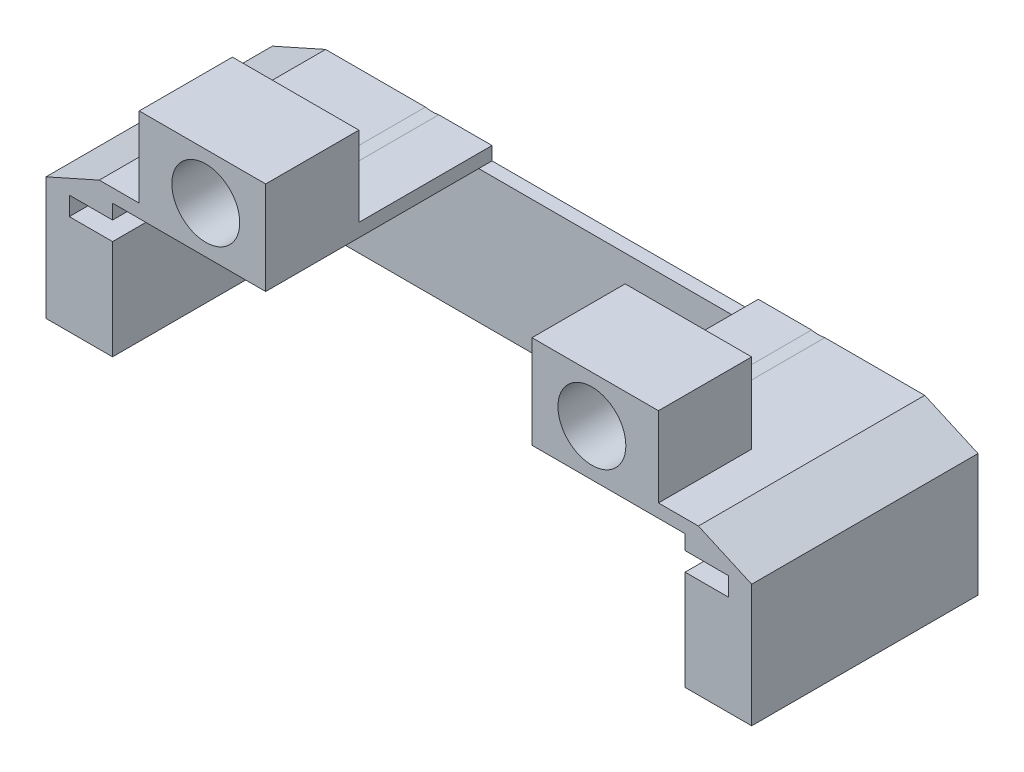
ISO-10303-21;
HEADER;
FILE_DESCRIPTION(('STEP AP214'),'2;1');
FILE_NAME('part.step','',(''),(''),'','','');
FILE_SCHEMA(('AUTOMOTIVE_DESIGN { 1 0 10303 214 1 1 1 1 }'));
ENDSEC;
DATA;
#1=APPLICATION_CONTEXT('core data for automotive mechanical design processes');
#2=APPLICATION_PROTOCOL_DEFINITION('international standard','automotive_design',2000,#1);
#3=PRODUCT_CONTEXT('',#1,'mechanical');
#4=PRODUCT('Part','Part','',(#3));
#5=PRODUCT_RELATED_PRODUCT_CATEGORY('part','',(#4));
#6=PRODUCT_DEFINITION_FORMATION('','',#4);
#7=PRODUCT_DEFINITION_CONTEXT('part definition',#1,'design');
#8=PRODUCT_DEFINITION('design','',#6,#7);
#9=PRODUCT_DEFINITION_SHAPE('','',#8);
#10=(LENGTH_UNIT() NAMED_UNIT(*) SI_UNIT(.MILLI.,.METRE.));
#11=(NAMED_UNIT(*) PLANE_ANGLE_UNIT() SI_UNIT($,.RADIAN.));
#12=(NAMED_UNIT(*) SI_UNIT($,.STERADIAN.) SOLID_ANGLE_UNIT());
#13=UNCERTAINTY_MEASURE_WITH_UNIT(LENGTH_MEASURE(1.E-05),#10,'distance_accuracy_value','');
#14=(GEOMETRIC_REPRESENTATION_CONTEXT(3) GLOBAL_UNCERTAINTY_ASSIGNED_CONTEXT((#13)) GLOBAL_UNIT_ASSIGNED_CONTEXT((#10,
#11,#12)) REPRESENTATION_CONTEXT('',''));
#15=CARTESIAN_POINT('',(0.,0.,0.));
#16=DIRECTION('',(0.,0.,1.));
#17=DIRECTION('',(1.,0.,0.));
#18=AXIS2_PLACEMENT_3D('',#15,#16,#17);
#19=CARTESIAN_POINT('',(-54.9079919345788,27.1123089983022,17.));
#20=DIRECTION('',(0.,-1.,0.));
#21=DIRECTION('',(0.,0.,-1.));
#22=AXIS2_PLACEMENT_3D('',#19,#20,#21);
#23=PLANE('',#22);
#24=DIRECTION('',(0.,0.,1.));
#25=VECTOR('',#24,1.);
#26=CARTESIAN_POINT('',(-39.4079919345789,27.1123089983022,0.));
#27=LINE('',#26,#25);
#28=CARTESIAN_POINT('',(-39.4079919345789,27.1123089983022,10.));
#29=VERTEX_POINT('',#28);
#30=CARTESIAN_POINT('',(-39.4079919345789,27.1123089983022,17.));
#31=VERTEX_POINT('',#30);
#32=EDGE_CURVE('E464',#29,#31,#27,.T.);
#33=ORIENTED_EDGE('',*,*,#32,.F.);
#34=DIRECTION('',(1.,0.,0.));
#35=VECTOR('',#34,1.);
#36=CARTESIAN_POINT('',(-48.9079919345789,27.1123089983022,10.));
#37=LINE('',#36,#35);
#38=CARTESIAN_POINT('',(-48.9079919345789,27.1123089983022,10.));
#39=VERTEX_POINT('',#38);
#40=EDGE_CURVE('E413',#39,#29,#37,.T.);
#41=ORIENTED_EDGE('',*,*,#40,.F.);
#42=DIRECTION('',(0.,0.,1.));
#43=VECTOR('',#42,1.);
#44=CARTESIAN_POINT('',(-48.9079919345789,27.1123089983022,0.));
#45=LINE('',#44,#43);
#46=CARTESIAN_POINT('',(-48.9079919345789,27.1123089983022,17.));
#47=VERTEX_POINT('',#46);
#48=EDGE_CURVE('E280',#39,#47,#45,.T.);
#49=ORIENTED_EDGE('',*,*,#48,.T.);
#50=DIRECTION('',(-1.,0.,0.));
#51=VECTOR('',#50,1.);
#52=CARTESIAN_POINT('',(-54.9079919345788,27.1123089983022,17.));
#53=LINE('',#52,#51);
#54=EDGE_CURVE('E375',#31,#47,#53,.T.);
#55=ORIENTED_EDGE('',*,*,#54,.F.);
#56=EDGE_LOOP('',(#33,#41,#49,#55));
#57=FACE_BOUND('',#56,.T.);
#58=ADVANCED_FACE('F33',(#57),#23,.F.);
#59=CARTESIAN_POINT('',(-50.9079919345788,10.1123089983022,1.));
#60=DIRECTION('',(-1.,0.,0.));
#61=DIRECTION('',(0.,0.,1.));
#62=AXIS2_PLACEMENT_3D('',#59,#60,#61);
#63=PLANE('',#62);
#64=DIRECTION('',(0.,-1.,0.));
#65=VECTOR('',#64,1.);
#66=CARTESIAN_POINT('',(-50.9079919345788,10.1123089983022,1.));
#67=LINE('',#66,#65);
#68=CARTESIAN_POINT('',(-50.9079919345788,17.6123089983022,1.));
#69=VERTEX_POINT('',#68);
#70=CARTESIAN_POINT('',(-50.9079919345788,10.1123089983022,1.));
#71=VERTEX_POINT('',#70);
#72=EDGE_CURVE('E338',#69,#71,#67,.T.);
#73=ORIENTED_EDGE('',*,*,#72,.F.);
#74=DIRECTION('',(0.,0.,1.));
#75=VECTOR('',#74,1.);
#76=CARTESIAN_POINT('',(-50.9079919345788,17.6123089983022,1.));
#77=LINE('',#76,#75);
#78=CARTESIAN_POINT('',(-50.9079919345788,17.6123089983022,17.));
#79=VERTEX_POINT('',#78);
#80=EDGE_CURVE('E320',#69,#79,#77,.T.);
#81=ORIENTED_EDGE('',*,*,#80,.T.);
#82=DIRECTION('',(0.,-1.,0.));
#83=VECTOR('',#82,1.);
#84=CARTESIAN_POINT('',(-50.9079919345788,10.1123089983022,17.));
#85=LINE('',#84,#83);
#86=CARTESIAN_POINT('',(-50.9079919345788,10.1123089983022,17.));
#87=VERTEX_POINT('',#86);
#88=EDGE_CURVE('E331',#79,#87,#85,.T.);
#89=ORIENTED_EDGE('',*,*,#88,.T.);
#90=DIRECTION('',(0.,0.,1.));
#91=VECTOR('',#90,1.);
#92=CARTESIAN_POINT('',(-50.9079919345788,10.1123089983022,1.));
#93=LINE('',#92,#91);
#94=EDGE_CURVE('E346',#71,#87,#93,.T.);
#95=ORIENTED_EDGE('',*,*,#94,.F.);
#96=EDGE_LOOP('',(#73,#81,#89,#95));
#97=FACE_BOUND('',#96,.T.);
#98=ADVANCED_FACE('F615',(#97),#63,.F.);
#99=CARTESIAN_POINT('',(-7.90799193457886,10.1123089983022,1.));
#100=DIRECTION('',(1.,0.,0.));
#101=DIRECTION('',(0.,1.,0.));
#102=AXIS2_PLACEMENT_3D('',#99,#100,#101);
#103=PLANE('',#102);
#104=DIRECTION('',(0.,1.,0.));
#105=VECTOR('',#104,1.);
#106=CARTESIAN_POINT('',(-7.90799193457886,10.1123089983022,17.));
#107=LINE('',#106,#105);
#108=CARTESIAN_POINT('',(-7.90799193457886,10.1123089983022,17.));
#109=VERTEX_POINT('',#108);
#110=CARTESIAN_POINT('',(-7.90799193457886,17.6123089983022,17.));
#111=VERTEX_POINT('',#110);
#112=EDGE_CURVE('E352',#109,#111,#107,.T.);
#113=ORIENTED_EDGE('',*,*,#112,.T.);
#114=DIRECTION('',(0.,0.,-1.));
#115=VECTOR('',#114,1.);
#116=CARTESIAN_POINT('',(-7.90799193457886,17.6123089983022,1.));
#117=LINE('',#116,#115);
#118=CARTESIAN_POINT('',(-7.90799193457886,17.6123089983022,1.));
#119=VERTEX_POINT('',#118);
#120=EDGE_CURVE('E384',#111,#119,#117,.T.);
#121=ORIENTED_EDGE('',*,*,#120,.T.);
#122=DIRECTION('',(0.,1.,0.));
#123=VECTOR('',#122,1.);
#124=CARTESIAN_POINT('',(-7.90799193457886,10.1123089983022,1.));
#125=LINE('',#124,#123);
#126=CARTESIAN_POINT('',(-7.90799193457886,10.1123089983022,1.));
#127=VERTEX_POINT('',#126);
#128=EDGE_CURVE('E339',#127,#119,#125,.T.);
#129=ORIENTED_EDGE('',*,*,#128,.F.);
#130=DIRECTION('',(0.,0.,1.));
#131=VECTOR('',#130,1.);
#132=CARTESIAN_POINT('',(-7.90799193457886,10.1123089983022,1.));
#133=LINE('',#132,#131);
#134=EDGE_CURVE('E366',#127,#109,#133,.T.);
#135=ORIENTED_EDGE('',*,*,#134,.T.);
#136=EDGE_LOOP('',(#113,#121,#129,#135));
#137=FACE_BOUND('',#136,.T.);
#138=ADVANCED_FACE('F578',(#137),#103,.F.);
#139=CARTESIAN_POINT('',(0.,0.,17.));
#140=DIRECTION('',(0.,0.,1.));
#141=DIRECTION('',(1.,0.,0.));
#142=AXIS2_PLACEMENT_3D('',#139,#140,#141);
#143=PLANE('',#142);
#144=DIRECTION('',(0.913085332280026,-0.407768532350246,0.));
#145=VECTOR('',#144,1.);
#146=CARTESIAN_POINT('',(-6.90799193457886,21.1123089983022,17.));
#147=LINE('',#146,#145);
#148=CARTESIAN_POINT('',(-6.90799193457886,21.1123089983022,17.));
#149=VERTEX_POINT('',#148);
#150=CARTESIAN_POINT('',(-2.90799193457886,19.3259763613206,17.));
#151=VERTEX_POINT('',#150);
#152=EDGE_CURVE('E48',#149,#151,#147,.T.);
#153=ORIENTED_EDGE('',*,*,#152,.F.);
#154=DIRECTION('',(1.,0.,0.));
#155=VECTOR('',#154,1.);
#156=CARTESIAN_POINT('',(-3.90799193457886,21.1123089983022,17.));
#157=LINE('',#156,#155);
#158=CARTESIAN_POINT('',(-9.90799193457886,21.1123089983022,17.));
#159=VERTEX_POINT('',#158);
#160=EDGE_CURVE('E262',#159,#149,#157,.T.);
#161=ORIENTED_EDGE('',*,*,#160,.F.);
#162=DIRECTION('',(0.,-1.,0.));
#163=VECTOR('',#162,1.);
#164=CARTESIAN_POINT('',(-9.90799193457886,27.1123089983022,17.));
#165=LINE('',#164,#163);
#166=CARTESIAN_POINT('',(-9.90799193457886,27.1123089983022,17.));
#167=VERTEX_POINT('',#166);
#168=EDGE_CURVE('E273',#167,#159,#165,.T.);
#169=ORIENTED_EDGE('',*,*,#168,.F.);
#170=CARTESIAN_POINT('',(-19.4079919345789,27.1123089983022,17.));
#171=VERTEX_POINT('',#170);
#172=EDGE_CURVE('E377',#167,#171,#53,.T.);
#173=ORIENTED_EDGE('',*,*,#172,.T.);
#174=DIRECTION('',(0.,1.,0.));
#175=VECTOR('',#174,1.);
#176=CARTESIAN_POINT('',(-19.4079919345789,27.1123089983022,17.));
#177=LINE('',#176,#175);
#178=CARTESIAN_POINT('',(-19.4079919345789,20.1123089983022,17.));
#179=VERTEX_POINT('',#178);
#180=EDGE_CURVE('E448',#179,#171,#177,.T.);
#181=ORIENTED_EDGE('',*,*,#180,.F.);
#182=DIRECTION('',(-1.,0.,0.));
#183=VECTOR('',#182,1.);
#184=CARTESIAN_POINT('',(-50.9079919345788,20.1123089983022,17.));
#185=LINE('',#184,#183);
#186=CARTESIAN_POINT('',(-7.90799193457886,20.1123089983022,17.));
#187=VERTEX_POINT('',#186);
#188=EDGE_CURVE('E356',#187,#179,#185,.T.);
#189=ORIENTED_EDGE('',*,*,#188,.F.);
#190=CARTESIAN_POINT('',(-7.90799193457886,19.0123089983022,17.));
#191=VERTEX_POINT('',#190);
#192=EDGE_CURVE('E351',#191,#187,#107,.T.);
#193=ORIENTED_EDGE('',*,*,#192,.F.);
#194=DIRECTION('',(-1.,0.,0.));
#195=VECTOR('',#194,1.);
#196=CARTESIAN_POINT('',(-4.65799193457886,19.0123089983022,17.));
#197=LINE('',#196,#195);
#198=CARTESIAN_POINT('',(-4.65799193457886,19.0123089983022,17.));
#199=VERTEX_POINT('',#198);
#200=EDGE_CURVE('E301',#199,#191,#197,.T.);
#201=ORIENTED_EDGE('',*,*,#200,.F.);
#202=DIRECTION('',(0.,1.,0.));
#203=VECTOR('',#202,1.);
#204=CARTESIAN_POINT('',(-4.65799193457886,17.6123089983022,17.));
#205=LINE('',#204,#203);
#206=CARTESIAN_POINT('',(-4.65799193457886,17.6123089983022,17.));
#207=VERTEX_POINT('',#206);
#208=EDGE_CURVE('E282',#207,#199,#205,.T.);
#209=ORIENTED_EDGE('',*,*,#208,.F.);
#210=DIRECTION('',(1.,0.,0.));
#211=VECTOR('',#210,1.);
#212=CARTESIAN_POINT('',(-4.65799193457886,17.6123089983022,17.));
#213=LINE('',#212,#211);
#214=EDGE_CURVE('E306',#111,#207,#213,.T.);
#215=ORIENTED_EDGE('',*,*,#214,.F.);
#216=ORIENTED_EDGE('',*,*,#112,.F.);
#217=DIRECTION('',(1.,0.,0.));
#218=VECTOR('',#217,1.);
#219=CARTESIAN_POINT('',(-54.9079919345788,10.1123089983022,17.));
#220=LINE('',#219,#218);
#221=CARTESIAN_POINT('',(-2.90799193457886,10.1123089983022,17.));
#222=VERTEX_POINT('',#221);
#223=EDGE_CURVE('E376',#109,#222,#220,.T.);
#224=ORIENTED_EDGE('',*,*,#223,.T.);
#225=DIRECTION('',(0.,-1.,0.));
#226=VECTOR('',#225,1.);
#227=CARTESIAN_POINT('',(-2.90799193457886,21.1123089983022,17.));
#228=LINE('',#227,#226);
#229=EDGE_CURVE('E519',#151,#222,#228,.T.);
#230=ORIENTED_EDGE('',*,*,#229,.F.);
#231=EDGE_LOOP('',(#153,#161,#169,#173,#181,#189,#193,#201,#209,#215,#216,#224,#230));
#232=FACE_BOUND('',#231,.T.);
#233=CARTESIAN_POINT('',(-14.9079919345789,23.6123089983022,17.));
#234=DIRECTION('',(0.,0.,1.));
#235=DIRECTION('',(1.,0.,0.));
#236=AXIS2_PLACEMENT_3D('',#233,#234,#235);
#237=CIRCLE('',#236,2.55);
#238=CARTESIAN_POINT('',(-12.3579919345789,23.6123089983022,17.));
#239=VERTEX_POINT('',#238);
#240=EDGE_CURVE('E323',#239,#239,#237,.T.);
#241=ORIENTED_EDGE('',*,*,#240,.F.);
#242=EDGE_LOOP('',(#241));
#243=FACE_BOUND('',#242,.T.);
#244=ADVANCED_FACE('F515',(#232,#243),#143,.T.);
#245=CARTESIAN_POINT('',(-54.9079919345788,10.1123089983022,17.));
#246=DIRECTION('',(0.,1.,0.));
#247=DIRECTION('',(0.,0.,1.));
#248=AXIS2_PLACEMENT_3D('',#245,#246,#247);
#249=PLANE('',#248);
#250=ORIENTED_EDGE('',*,*,#223,.F.);
#251=ORIENTED_EDGE('',*,*,#134,.F.);
#252=DIRECTION('',(1.,0.,0.));
#253=VECTOR('',#252,1.);
#254=CARTESIAN_POINT('',(-36.9079919345788,10.1123089983022,1.));
#255=LINE('',#254,#253);
#256=EDGE_CURVE('E362',#71,#127,#255,.T.);
#257=ORIENTED_EDGE('',*,*,#256,.F.);
#258=ORIENTED_EDGE('',*,*,#94,.T.);
#259=CARTESIAN_POINT('',(-55.9079919345788,10.1123089983022,17.));
#260=VERTEX_POINT('',#259);
#261=EDGE_CURVE('E372',#260,#87,#220,.T.);
#262=ORIENTED_EDGE('',*,*,#261,.F.);
#263=DIRECTION('',(0.,0.,1.));
#264=VECTOR('',#263,1.);
#265=CARTESIAN_POINT('',(-55.9079919345788,10.1123089983022,17.));
#266=LINE('',#265,#264);
#267=CARTESIAN_POINT('',(-55.9079919345788,10.1123089983022,0.));
#268=VERTEX_POINT('',#267);
#269=EDGE_CURVE('E539',#268,#260,#266,.T.);
#270=ORIENTED_EDGE('',*,*,#269,.F.);
#271=DIRECTION('',(1.,0.,0.));
#272=VECTOR('',#271,1.);
#273=CARTESIAN_POINT('',(-54.9079919345788,10.1123089983022,0.));
#274=LINE('',#273,#272);
#275=CARTESIAN_POINT('',(-2.90799193457886,10.1123089983022,0.));
#276=VERTEX_POINT('',#275);
#277=EDGE_CURVE('E371',#268,#276,#274,.T.);
#278=ORIENTED_EDGE('',*,*,#277,.T.);
#279=DIRECTION('',(0.,0.,-1.));
#280=VECTOR('',#279,1.);
#281=CARTESIAN_POINT('',(-2.90799193457886,10.1123089983022,17.));
#282=LINE('',#281,#280);
#283=EDGE_CURVE('E532',#222,#276,#282,.T.);
#284=ORIENTED_EDGE('',*,*,#283,.F.);
#285=EDGE_LOOP('',(#250,#251,#257,#258,#262,#270,#278,#284));
#286=FACE_BOUND('',#285,.T.);
#287=ADVANCED_FACE('F35',(#286),#249,.F.);
#288=DIRECTION('',(0.,0.,1.));
#289=VECTOR('',#288,1.);
#290=CARTESIAN_POINT('',(-9.90799193457886,27.1123089983022,0.));
#291=LINE('',#290,#289);
#292=CARTESIAN_POINT('',(-9.90799193457886,27.1123089983022,10.));
#293=VERTEX_POINT('',#292);
#294=EDGE_CURVE('E269',#293,#167,#291,.T.);
#295=ORIENTED_EDGE('',*,*,#294,.F.);
#296=CARTESIAN_POINT('',(-19.4079919345789,27.1123089983022,10.));
#297=VERTEX_POINT('',#296);
#298=EDGE_CURVE('E405',#297,#293,#37,.T.);
#299=ORIENTED_EDGE('',*,*,#298,.F.);
#300=DIRECTION('',(0.,0.,1.));
#301=VECTOR('',#300,1.);
#302=CARTESIAN_POINT('',(-19.4079919345789,27.1123089983022,0.));
#303=LINE('',#302,#301);
#304=EDGE_CURVE('E400',#297,#171,#303,.T.);
#305=ORIENTED_EDGE('',*,*,#304,.T.);
#306=ORIENTED_EDGE('',*,*,#172,.F.);
#307=EDGE_LOOP('',(#295,#299,#305,#306));
#308=FACE_BOUND('',#307,.T.);
#309=ADVANCED_FACE('F411',(#308),#23,.F.);
#310=DIRECTION('',(0.913085332280025,0.407768532350249,0.));
#311=VECTOR('',#310,1.);
#312=CARTESIAN_POINT('',(-55.9079919345788,19.3259763613206,17.));
#313=LINE('',#312,#311);
#314=CARTESIAN_POINT('',(-55.9079919345788,19.3259763613206,17.));
#315=VERTEX_POINT('',#314);
#316=CARTESIAN_POINT('',(-51.9079919345788,21.1123089983022,17.));
#317=VERTEX_POINT('',#316);
#318=EDGE_CURVE('E522',#315,#317,#313,.T.);
#319=ORIENTED_EDGE('',*,*,#318,.F.);
#320=DIRECTION('',(0.,1.,0.));
#321=VECTOR('',#320,1.);
#322=CARTESIAN_POINT('',(-55.9079919345788,21.1123089983022,17.));
#323=LINE('',#322,#321);
#324=EDGE_CURVE('E510',#260,#315,#323,.T.);
#325=ORIENTED_EDGE('',*,*,#324,.F.);
#326=ORIENTED_EDGE('',*,*,#261,.T.);
#327=ORIENTED_EDGE('',*,*,#88,.F.);
#328=CARTESIAN_POINT('',(-54.1579919345788,17.6123089983022,17.));
#329=VERTEX_POINT('',#328);
#330=EDGE_CURVE('E288',#329,#79,#213,.T.);
#331=ORIENTED_EDGE('',*,*,#330,.F.);
#332=DIRECTION('',(0.,-1.,0.));
#333=VECTOR('',#332,1.);
#334=CARTESIAN_POINT('',(-54.1579919345788,17.6123089983022,17.));
#335=LINE('',#334,#333);
#336=CARTESIAN_POINT('',(-54.1579919345788,19.0123089983022,17.));
#337=VERTEX_POINT('',#336);
#338=EDGE_CURVE('E303',#337,#329,#335,.T.);
#339=ORIENTED_EDGE('',*,*,#338,.F.);
#340=CARTESIAN_POINT('',(-50.9079919345788,19.0123089983022,17.));
#341=VERTEX_POINT('',#340);
#342=EDGE_CURVE('E300',#341,#337,#197,.T.);
#343=ORIENTED_EDGE('',*,*,#342,.F.);
#344=CARTESIAN_POINT('',(-50.9079919345788,20.1123089983022,17.));
#345=VERTEX_POINT('',#344);
#346=EDGE_CURVE('E348',#345,#341,#85,.T.);
#347=ORIENTED_EDGE('',*,*,#346,.F.);
#348=CARTESIAN_POINT('',(-39.4079919345789,20.1123089983022,17.));
#349=VERTEX_POINT('',#348);
#350=EDGE_CURVE('E355',#349,#345,#185,.T.);
#351=ORIENTED_EDGE('',*,*,#350,.F.);
#352=DIRECTION('',(0.,-1.,0.));
#353=VECTOR('',#352,1.);
#354=CARTESIAN_POINT('',(-39.4079919345789,27.1123089983022,17.));
#355=LINE('',#354,#353);
#356=EDGE_CURVE('E453',#31,#349,#355,.T.);
#357=ORIENTED_EDGE('',*,*,#356,.F.);
#358=ORIENTED_EDGE('',*,*,#54,.T.);
#359=DIRECTION('',(0.,1.,0.));
#360=VECTOR('',#359,1.);
#361=CARTESIAN_POINT('',(-48.9079919345789,27.1123089983022,17.));
#362=LINE('',#361,#360);
#363=CARTESIAN_POINT('',(-48.9079919345789,21.1123089983022,17.));
#364=VERTEX_POINT('',#363);
#365=EDGE_CURVE('E471',#364,#47,#362,.T.);
#366=ORIENTED_EDGE('',*,*,#365,.F.);
#367=DIRECTION('',(1.,0.,0.));
#368=VECTOR('',#367,1.);
#369=CARTESIAN_POINT('',(-54.9079919345788,21.1123089983022,17.));
#370=LINE('',#369,#368);
#371=EDGE_CURVE('E463',#317,#364,#370,.T.);
#372=ORIENTED_EDGE('',*,*,#371,.F.);
#373=EDGE_LOOP('',(#319,#325,#326,#327,#331,#339,#343,#347,#351,#357,#358,#366,#372));
#374=FACE_BOUND('',#373,.T.);
#375=CARTESIAN_POINT('',(-43.9079919345789,23.6123089983022,17.));
#376=DIRECTION('',(0.,0.,1.));
#377=DIRECTION('',(1.,0.,0.));
#378=AXIS2_PLACEMENT_3D('',#375,#376,#377);
#379=CIRCLE('',#378,2.55);
#380=CARTESIAN_POINT('',(-41.3579919345789,23.6123089983022,17.));
#381=VERTEX_POINT('',#380);
#382=EDGE_CURVE('E325',#381,#381,#379,.T.);
#383=ORIENTED_EDGE('',*,*,#382,.F.);
#384=EDGE_LOOP('',(#383));
#385=FACE_BOUND('',#384,.T.);
#386=ADVANCED_FACE('F489',(#374,#385),#143,.T.);
#387=CARTESIAN_POINT('',(0.,0.,0.));
#388=DIRECTION('',(0.,0.,1.));
#389=DIRECTION('',(1.,0.,0.));
#390=AXIS2_PLACEMENT_3D('',#387,#388,#389);
#391=PLANE('',#390);
#392=DIRECTION('',(1.,0.,0.));
#393=VECTOR('',#392,1.);
#394=CARTESIAN_POINT('',(-3.90799193457886,21.1123089983022,0.));
#395=LINE('',#394,#393);
#396=CARTESIAN_POINT('',(-14.4054981535228,21.1123089983022,0.));
#397=VERTEX_POINT('',#396);
#398=CARTESIAN_POINT('',(-6.90799193457886,21.1123089983022,0.));
#399=VERTEX_POINT('',#398);
#400=EDGE_CURVE('E259',#397,#399,#395,.T.);
#401=ORIENTED_EDGE('',*,*,#400,.T.);
#402=DIRECTION('',(0.913085332280026,-0.407768532350246,0.));
#403=VECTOR('',#402,1.);
#404=CARTESIAN_POINT('',(-6.90799193457886,21.1123089983022,0.));
#405=LINE('',#404,#403);
#406=CARTESIAN_POINT('',(-2.90799193457886,19.3259763613206,0.));
#407=VERTEX_POINT('',#406);
#408=EDGE_CURVE('E246',#399,#407,#405,.T.);
#409=ORIENTED_EDGE('',*,*,#408,.T.);
#410=DIRECTION('',(0.,1.,0.));
#411=VECTOR('',#410,1.);
#412=CARTESIAN_POINT('',(-2.90799193457886,10.1123089983022,0.));
#413=LINE('',#412,#411);
#414=EDGE_CURVE('E535',#276,#407,#413,.T.);
#415=ORIENTED_EDGE('',*,*,#414,.F.);
#416=ORIENTED_EDGE('',*,*,#277,.F.);
#417=DIRECTION('',(0.,-1.,0.));
#418=VECTOR('',#417,1.);
#419=CARTESIAN_POINT('',(-55.9079919345788,10.1123089983022,0.));
#420=LINE('',#419,#418);
#421=CARTESIAN_POINT('',(-55.9079919345788,19.3259763613206,0.));
#422=VERTEX_POINT('',#421);
#423=EDGE_CURVE('E537',#422,#268,#420,.T.);
#424=ORIENTED_EDGE('',*,*,#423,.F.);
#425=DIRECTION('',(0.913085332280025,0.407768532350249,0.));
#426=VECTOR('',#425,1.);
#427=CARTESIAN_POINT('',(-55.9079919345788,19.3259763613206,0.));
#428=LINE('',#427,#426);
#429=CARTESIAN_POINT('',(-51.9079919345788,21.1123089983022,0.));
#430=VERTEX_POINT('',#429);
#431=EDGE_CURVE('E56',#422,#430,#428,.T.);
#432=ORIENTED_EDGE('',*,*,#431,.T.);
#433=DIRECTION('',(1.,0.,0.));
#434=VECTOR('',#433,1.);
#435=CARTESIAN_POINT('',(-54.9079919345788,21.1123089983022,0.));
#436=LINE('',#435,#434);
#437=CARTESIAN_POINT('',(-44.4104857156348,21.1123089983022,0.));
#438=VERTEX_POINT('',#437);
#439=EDGE_CURVE('E469',#430,#438,#436,.T.);
#440=ORIENTED_EDGE('',*,*,#439,.T.);
#441=CARTESIAN_POINT('',(-43.9079919345789,23.6123089983022,0.));
#442=DIRECTION('',(0.,0.,1.));
#443=DIRECTION('',(1.,0.,0.));
#444=AXIS2_PLACEMENT_3D('',#441,#442,#443);
#445=CIRCLE('',#444,2.55);
#446=CARTESIAN_POINT('',(-43.4054981535229,21.1123089983022,0.));
#447=VERTEX_POINT('',#446);
#448=EDGE_CURVE('E328',#438,#447,#445,.T.);
#449=ORIENTED_EDGE('',*,*,#448,.T.);
#450=DIRECTION('',(1.,0.,0.));
#451=VECTOR('',#450,1.);
#452=CARTESIAN_POINT('',(-48.9079919345789,21.1123089983022,0.));
#453=LINE('',#452,#451);
#454=CARTESIAN_POINT('',(-39.4079919345789,21.1123089983022,0.));
#455=VERTEX_POINT('',#454);
#456=EDGE_CURVE('E428',#447,#455,#453,.T.);
#457=ORIENTED_EDGE('',*,*,#456,.T.);
#458=DIRECTION('',(0.,-1.,0.));
#459=VECTOR('',#458,1.);
#460=CARTESIAN_POINT('',(-39.4079919345789,27.1123089983022,0.));
#461=LINE('',#460,#459);
#462=CARTESIAN_POINT('',(-39.4079919345789,20.1123089983022,0.));
#463=VERTEX_POINT('',#462);
#464=EDGE_CURVE('E455',#455,#463,#461,.T.);
#465=ORIENTED_EDGE('',*,*,#464,.T.);
#466=DIRECTION('',(1.,0.,0.));
#467=VECTOR('',#466,1.);
#468=CARTESIAN_POINT('',(-39.4079919345789,20.1123089983022,0.));
#469=LINE('',#468,#467);
#470=CARTESIAN_POINT('',(-19.4079919345789,20.1123089983022,0.));
#471=VERTEX_POINT('',#470);
#472=EDGE_CURVE('E449',#463,#471,#469,.T.);
#473=ORIENTED_EDGE('',*,*,#472,.T.);
#474=DIRECTION('',(0.,1.,0.));
#475=VECTOR('',#474,1.);
#476=CARTESIAN_POINT('',(-19.4079919345789,27.1123089983022,0.));
#477=LINE('',#476,#475);
#478=CARTESIAN_POINT('',(-19.4079919345789,21.1123089983022,0.));
#479=VERTEX_POINT('',#478);
#480=EDGE_CURVE('E452',#471,#479,#477,.T.);
#481=ORIENTED_EDGE('',*,*,#480,.T.);
#482=CARTESIAN_POINT('',(-15.4104857156349,21.1123089983022,0.));
#483=VERTEX_POINT('',#482);
#484=EDGE_CURVE('E505',#479,#483,#453,.T.);
#485=ORIENTED_EDGE('',*,*,#484,.T.);
#486=CARTESIAN_POINT('',(-14.9079919345789,23.6123089983022,0.));
#487=DIRECTION('',(0.,0.,1.));
#488=DIRECTION('',(1.,0.,0.));
#489=AXIS2_PLACEMENT_3D('',#486,#487,#488);
#490=CIRCLE('',#489,2.55);
#491=EDGE_CURVE('E268',#483,#397,#490,.T.);
#492=ORIENTED_EDGE('',*,*,#491,.T.);
#493=EDGE_LOOP('',(#401,#409,#415,#416,#424,#432,#440,#449,#457,#465,#473,#481,#485,#492));
#494=FACE_BOUND('',#493,.T.);
#495=ADVANCED_FACE('F265',(#494),#391,.F.);
#496=CARTESIAN_POINT('',(-36.9079919345788,27.1123089983022,1.));
#497=DIRECTION('',(0.,0.,-1.));
#498=DIRECTION('',(-1.,0.,0.));
#499=AXIS2_PLACEMENT_3D('',#496,#497,#498);
#500=PLANE('',#499);
#501=DIRECTION('',(-1.,0.,0.));
#502=VECTOR('',#501,1.);
#503=CARTESIAN_POINT('',(-50.9079919345788,20.1123089983022,1.));
#504=LINE('',#503,#502);
#505=CARTESIAN_POINT('',(-7.90799193457886,20.1123089983022,1.));
#506=VERTEX_POINT('',#505);
#507=CARTESIAN_POINT('',(-19.4079919345789,20.1123089983022,1.));
#508=VERTEX_POINT('',#507);
#509=EDGE_CURVE('E343',#506,#508,#504,.T.);
#510=ORIENTED_EDGE('',*,*,#509,.T.);
#511=CARTESIAN_POINT('',(-39.4079919345789,20.1123089983022,1.));
#512=VERTEX_POINT('',#511);
#513=EDGE_CURVE('E347',#508,#512,#504,.T.);
#514=ORIENTED_EDGE('',*,*,#513,.T.);
#515=CARTESIAN_POINT('',(-50.9079919345788,20.1123089983022,1.));
#516=VERTEX_POINT('',#515);
#517=EDGE_CURVE('E342',#512,#516,#504,.T.);
#518=ORIENTED_EDGE('',*,*,#517,.T.);
#519=CARTESIAN_POINT('',(-50.9079919345788,19.0123089983022,1.));
#520=VERTEX_POINT('',#519);
#521=EDGE_CURVE('E334',#516,#520,#67,.T.);
#522=ORIENTED_EDGE('',*,*,#521,.T.);
#523=DIRECTION('',(-1.,0.,0.));
#524=VECTOR('',#523,1.);
#525=CARTESIAN_POINT('',(-4.65799193457886,19.0123089983022,1.));
#526=LINE('',#525,#524);
#527=CARTESIAN_POINT('',(-54.1579919345788,19.0123089983022,1.));
#528=VERTEX_POINT('',#527);
#529=EDGE_CURVE('E287',#520,#528,#526,.T.);
#530=ORIENTED_EDGE('',*,*,#529,.T.);
#531=DIRECTION('',(0.,-1.,0.));
#532=VECTOR('',#531,1.);
#533=CARTESIAN_POINT('',(-54.1579919345788,17.6123089983022,1.));
#534=LINE('',#533,#532);
#535=CARTESIAN_POINT('',(-54.1579919345788,17.6123089983022,1.));
#536=VERTEX_POINT('',#535);
#537=EDGE_CURVE('E291',#528,#536,#534,.T.);
#538=ORIENTED_EDGE('',*,*,#537,.T.);
#539=DIRECTION('',(1.,0.,0.));
#540=VECTOR('',#539,1.);
#541=CARTESIAN_POINT('',(-4.65799193457886,17.6123089983022,1.));
#542=LINE('',#541,#540);
#543=EDGE_CURVE('E295',#536,#69,#542,.T.);
#544=ORIENTED_EDGE('',*,*,#543,.T.);
#545=ORIENTED_EDGE('',*,*,#72,.T.);
#546=ORIENTED_EDGE('',*,*,#256,.T.);
#547=ORIENTED_EDGE('',*,*,#128,.T.);
#548=CARTESIAN_POINT('',(-4.65799193457886,17.6123089983022,1.));
#549=VERTEX_POINT('',#548);
#550=EDGE_CURVE('E294',#119,#549,#542,.T.);
#551=ORIENTED_EDGE('',*,*,#550,.T.);
#552=DIRECTION('',(0.,1.,0.));
#553=VECTOR('',#552,1.);
#554=CARTESIAN_POINT('',(-4.65799193457886,17.6123089983022,1.));
#555=LINE('',#554,#553);
#556=CARTESIAN_POINT('',(-4.65799193457886,19.0123089983022,1.));
#557=VERTEX_POINT('',#556);
#558=EDGE_CURVE('E284',#549,#557,#555,.T.);
#559=ORIENTED_EDGE('',*,*,#558,.T.);
#560=CARTESIAN_POINT('',(-7.90799193457886,19.0123089983022,1.));
#561=VERTEX_POINT('',#560);
#562=EDGE_CURVE('E289',#557,#561,#526,.T.);
#563=ORIENTED_EDGE('',*,*,#562,.T.);
#564=EDGE_CURVE('E337',#561,#506,#125,.T.);
#565=ORIENTED_EDGE('',*,*,#564,.T.);
#566=EDGE_LOOP('',(#510,#514,#518,#522,#530,#538,#544,#545,#546,#547,#551,#559,#563,#565));
#567=FACE_BOUND('',#566,.T.);
#568=ADVANCED_FACE('F556',(#567),#500,.F.);
#569=CARTESIAN_POINT('',(-50.9079919345788,20.1123089983022,1.));
#570=DIRECTION('',(0.,1.,0.));
#571=DIRECTION('',(0.,0.,1.));
#572=AXIS2_PLACEMENT_3D('',#569,#570,#571);
#573=PLANE('',#572);
#574=ORIENTED_EDGE('',*,*,#517,.F.);
#575=DIRECTION('',(0.,0.,1.));
#576=VECTOR('',#575,1.);
#577=CARTESIAN_POINT('',(-39.4079919345789,20.1123089983022,1.));
#578=LINE('',#577,#576);
#579=EDGE_CURVE('E390',#512,#349,#578,.T.);
#580=ORIENTED_EDGE('',*,*,#579,.T.);
#581=ORIENTED_EDGE('',*,*,#350,.T.);
#582=DIRECTION('',(0.,0.,1.));
#583=VECTOR('',#582,1.);
#584=CARTESIAN_POINT('',(-50.9079919345788,20.1123089983022,1.));
#585=LINE('',#584,#583);
#586=EDGE_CURVE('E359',#516,#345,#585,.T.);
#587=ORIENTED_EDGE('',*,*,#586,.F.);
#588=EDGE_LOOP('',(#574,#580,#581,#587));
#589=FACE_BOUND('',#588,.T.);
#590=ADVANCED_FACE('F628',(#589),#573,.F.);
#591=ORIENTED_EDGE('',*,*,#346,.T.);
#592=DIRECTION('',(0.,0.,-1.));
#593=VECTOR('',#592,1.);
#594=CARTESIAN_POINT('',(-50.9079919345788,19.0123089983022,1.));
#595=LINE('',#594,#593);
#596=EDGE_CURVE('E311',#341,#520,#595,.T.);
#597=ORIENTED_EDGE('',*,*,#596,.T.);
#598=ORIENTED_EDGE('',*,*,#521,.F.);
#599=ORIENTED_EDGE('',*,*,#586,.T.);
#600=EDGE_LOOP('',(#591,#597,#598,#599));
#601=FACE_BOUND('',#600,.T.);
#602=ADVANCED_FACE('F621',(#601),#63,.F.);
#603=ORIENTED_EDGE('',*,*,#188,.T.);
#604=DIRECTION('',(0.,0.,-1.));
#605=VECTOR('',#604,1.);
#606=CARTESIAN_POINT('',(-19.4079919345789,20.1123089983022,1.));
#607=LINE('',#606,#605);
#608=EDGE_CURVE('E387',#179,#508,#607,.T.);
#609=ORIENTED_EDGE('',*,*,#608,.T.);
#610=ORIENTED_EDGE('',*,*,#509,.F.);
#611=DIRECTION('',(0.,0.,1.));
#612=VECTOR('',#611,1.);
#613=CARTESIAN_POINT('',(-7.90799193457886,20.1123089983022,1.));
#614=LINE('',#613,#612);
#615=EDGE_CURVE('E363',#506,#187,#614,.T.);
#616=ORIENTED_EDGE('',*,*,#615,.T.);
#617=EDGE_LOOP('',(#603,#609,#610,#616));
#618=FACE_BOUND('',#617,.T.);
#619=ADVANCED_FACE('F552',(#618),#573,.F.);
#620=ORIENTED_EDGE('',*,*,#564,.F.);
#621=DIRECTION('',(0.,0.,1.));
#622=VECTOR('',#621,1.);
#623=CARTESIAN_POINT('',(-7.90799193457886,19.0123089983022,1.));
#624=LINE('',#623,#622);
#625=EDGE_CURVE('E380',#561,#191,#624,.T.);
#626=ORIENTED_EDGE('',*,*,#625,.T.);
#627=ORIENTED_EDGE('',*,*,#192,.T.);
#628=ORIENTED_EDGE('',*,*,#615,.F.);
#629=EDGE_LOOP('',(#620,#626,#627,#628));
#630=FACE_BOUND('',#629,.T.);
#631=ADVANCED_FACE('F562',(#630),#103,.F.);
#632=CARTESIAN_POINT('',(-43.9079919345789,23.6123089983022,0.));
#633=DIRECTION('',(0.,0.,1.));
#634=DIRECTION('',(1.,0.,0.));
#635=AXIS2_PLACEMENT_3D('',#632,#633,#634);
#636=CYLINDRICAL_SURFACE('',#635,2.55);
#637=CARTESIAN_POINT('',(-43.9079919345789,23.6123089983022,10.));
#638=DIRECTION('',(0.,0.,1.));
#639=DIRECTION('',(1.,0.,0.));
#640=AXIS2_PLACEMENT_3D('',#637,#638,#639);
#641=CIRCLE('',#640,2.55);
#642=CARTESIAN_POINT('',(-44.4104857156349,21.1123089983022,10.));
#643=VERTEX_POINT('',#642);
#644=CARTESIAN_POINT('',(-43.4054981535228,21.1123089983022,10.));
#645=VERTEX_POINT('',#644);
#646=EDGE_CURVE('E431',#643,#645,#641,.F.);
#647=ORIENTED_EDGE('',*,*,#646,.T.);
#648=DIRECTION('',(0.,0.,1.));
#649=VECTOR('',#648,1.);
#650=CARTESIAN_POINT('',(-43.4054981535229,21.1123089983022,0.));
#651=LINE('',#650,#649);
#652=EDGE_CURVE('E445',#645,#447,#651,.F.);
#653=ORIENTED_EDGE('',*,*,#652,.T.);
#654=ORIENTED_EDGE('',*,*,#448,.F.);
#655=DIRECTION('',(0.,0.,1.));
#656=VECTOR('',#655,1.);
#657=CARTESIAN_POINT('',(-44.4104857156348,21.1123089983022,0.));
#658=LINE('',#657,#656);
#659=EDGE_CURVE('E442',#438,#643,#658,.T.);
#660=ORIENTED_EDGE('',*,*,#659,.T.);
#661=EDGE_LOOP('',(#647,#653,#654,#660));
#662=FACE_BOUND('',#661,.T.);
#663=ORIENTED_EDGE('',*,*,#382,.T.);
#664=EDGE_LOOP('',(#663));
#665=FACE_BOUND('',#664,.T.);
#666=ADVANCED_FACE('F599',(#662,#665),#636,.F.);
#667=CARTESIAN_POINT('',(-14.9079919345789,23.6123089983022,0.));
#668=DIRECTION('',(0.,0.,1.));
#669=DIRECTION('',(1.,0.,0.));
#670=AXIS2_PLACEMENT_3D('',#667,#668,#669);
#671=CYLINDRICAL_SURFACE('',#670,2.55);
#672=CARTESIAN_POINT('',(-14.9079919345789,23.6123089983022,10.));
#673=DIRECTION('',(0.,0.,1.));
#674=DIRECTION('',(1.,0.,0.));
#675=AXIS2_PLACEMENT_3D('',#672,#673,#674);
#676=CIRCLE('',#675,2.55);
#677=CARTESIAN_POINT('',(-15.4104857156349,21.1123089983022,10.));
#678=VERTEX_POINT('',#677);
#679=CARTESIAN_POINT('',(-14.4054981535228,21.1123089983022,10.));
#680=VERTEX_POINT('',#679);
#681=EDGE_CURVE('E427',#678,#680,#676,.F.);
#682=ORIENTED_EDGE('',*,*,#681,.T.);
#683=DIRECTION('',(0.,0.,1.));
#684=VECTOR('',#683,1.);
#685=CARTESIAN_POINT('',(-14.4054981535228,21.1123089983022,0.));
#686=LINE('',#685,#684);
#687=EDGE_CURVE('E440',#680,#397,#686,.F.);
#688=ORIENTED_EDGE('',*,*,#687,.T.);
#689=ORIENTED_EDGE('',*,*,#491,.F.);
#690=DIRECTION('',(0.,0.,1.));
#691=VECTOR('',#690,1.);
#692=CARTESIAN_POINT('',(-15.4104857156349,21.1123089983022,0.));
#693=LINE('',#692,#691);
#694=EDGE_CURVE('E437',#483,#678,#693,.T.);
#695=ORIENTED_EDGE('',*,*,#694,.T.);
#696=EDGE_LOOP('',(#682,#688,#689,#695));
#697=FACE_BOUND('',#696,.T.);
#698=ORIENTED_EDGE('',*,*,#240,.T.);
#699=EDGE_LOOP('',(#698));
#700=FACE_BOUND('',#699,.T.);
#701=ADVANCED_FACE('F602',(#697,#700),#671,.F.);
#702=CARTESIAN_POINT('',(-4.65799193457886,19.0123089983022,1.));
#703=DIRECTION('',(0.,1.,0.));
#704=DIRECTION('',(-1.,0.,0.));
#705=AXIS2_PLACEMENT_3D('',#702,#703,#704);
#706=PLANE('',#705);
#707=ORIENTED_EDGE('',*,*,#562,.F.);
#708=DIRECTION('',(0.,0.,1.));
#709=VECTOR('',#708,1.);
#710=CARTESIAN_POINT('',(-4.65799193457886,19.0123089983022,1.));
#711=LINE('',#710,#709);
#712=EDGE_CURVE('E297',#557,#199,#711,.T.);
#713=ORIENTED_EDGE('',*,*,#712,.T.);
#714=ORIENTED_EDGE('',*,*,#200,.T.);
#715=ORIENTED_EDGE('',*,*,#625,.F.);
#716=EDGE_LOOP('',(#707,#713,#714,#715));
#717=FACE_BOUND('',#716,.T.);
#718=ADVANCED_FACE('F568',(#717),#706,.F.);
#719=CARTESIAN_POINT('',(-4.65799193457886,17.6123089983022,1.));
#720=DIRECTION('',(0.,-1.,0.));
#721=DIRECTION('',(1.,0.,0.));
#722=AXIS2_PLACEMENT_3D('',#719,#720,#721);
#723=PLANE('',#722);
#724=ORIENTED_EDGE('',*,*,#214,.T.);
#725=DIRECTION('',(0.,0.,1.));
#726=VECTOR('',#725,1.);
#727=CARTESIAN_POINT('',(-4.65799193457886,17.6123089983022,1.));
#728=LINE('',#727,#726);
#729=EDGE_CURVE('E308',#549,#207,#728,.T.);
#730=ORIENTED_EDGE('',*,*,#729,.F.);
#731=ORIENTED_EDGE('',*,*,#550,.F.);
#732=ORIENTED_EDGE('',*,*,#120,.F.);
#733=EDGE_LOOP('',(#724,#730,#731,#732));
#734=FACE_BOUND('',#733,.T.);
#735=ADVANCED_FACE('F574',(#734),#723,.F.);
#736=CARTESIAN_POINT('',(-4.65799193457886,17.6123089983022,1.));
#737=DIRECTION('',(1.,0.,0.));
#738=DIRECTION('',(0.,1.,0.));
#739=AXIS2_PLACEMENT_3D('',#736,#737,#738);
#740=PLANE('',#739);
#741=ORIENTED_EDGE('',*,*,#208,.T.);
#742=ORIENTED_EDGE('',*,*,#712,.F.);
#743=ORIENTED_EDGE('',*,*,#558,.F.);
#744=ORIENTED_EDGE('',*,*,#729,.T.);
#745=EDGE_LOOP('',(#741,#742,#743,#744));
#746=FACE_BOUND('',#745,.T.);
#747=ADVANCED_FACE('F571',(#746),#740,.F.);
#748=ORIENTED_EDGE('',*,*,#543,.F.);
#749=DIRECTION('',(0.,0.,1.));
#750=VECTOR('',#749,1.);
#751=CARTESIAN_POINT('',(-54.1579919345788,17.6123089983022,1.));
#752=LINE('',#751,#750);
#753=EDGE_CURVE('E312',#536,#329,#752,.T.);
#754=ORIENTED_EDGE('',*,*,#753,.T.);
#755=ORIENTED_EDGE('',*,*,#330,.T.);
#756=ORIENTED_EDGE('',*,*,#80,.F.);
#757=EDGE_LOOP('',(#748,#754,#755,#756));
#758=FACE_BOUND('',#757,.T.);
#759=ADVANCED_FACE('F651',(#758),#723,.F.);
#760=ORIENTED_EDGE('',*,*,#342,.T.);
#761=DIRECTION('',(0.,0.,1.));
#762=VECTOR('',#761,1.);
#763=CARTESIAN_POINT('',(-54.1579919345788,19.0123089983022,1.));
#764=LINE('',#763,#762);
#765=EDGE_CURVE('E314',#528,#337,#764,.T.);
#766=ORIENTED_EDGE('',*,*,#765,.F.);
#767=ORIENTED_EDGE('',*,*,#529,.F.);
#768=ORIENTED_EDGE('',*,*,#596,.F.);
#769=EDGE_LOOP('',(#760,#766,#767,#768));
#770=FACE_BOUND('',#769,.T.);
#771=ADVANCED_FACE('F644',(#770),#706,.F.);
#772=CARTESIAN_POINT('',(-54.1579919345788,17.6123089983022,1.));
#773=DIRECTION('',(-1.,0.,0.));
#774=DIRECTION('',(0.,0.,1.));
#775=AXIS2_PLACEMENT_3D('',#772,#773,#774);
#776=PLANE('',#775);
#777=ORIENTED_EDGE('',*,*,#338,.T.);
#778=ORIENTED_EDGE('',*,*,#753,.F.);
#779=ORIENTED_EDGE('',*,*,#537,.F.);
#780=ORIENTED_EDGE('',*,*,#765,.T.);
#781=EDGE_LOOP('',(#777,#778,#779,#780));
#782=FACE_BOUND('',#781,.T.);
#783=ADVANCED_FACE('F647',(#782),#776,.F.);
#784=CARTESIAN_POINT('',(-3.90799193457886,21.1123089983022,0.));
#785=DIRECTION('',(0.,-1.,0.));
#786=DIRECTION('',(0.,0.,-1.));
#787=AXIS2_PLACEMENT_3D('',#784,#785,#786);
#788=PLANE('',#787);
#789=ORIENTED_EDGE('',*,*,#160,.T.);
#790=DIRECTION('',(0.,0.,1.));
#791=VECTOR('',#790,1.);
#792=CARTESIAN_POINT('',(-6.90799193457886,21.1123089983022,0.));
#793=LINE('',#792,#791);
#794=EDGE_CURVE('E249',#399,#149,#793,.T.);
#795=ORIENTED_EDGE('',*,*,#794,.F.);
#796=ORIENTED_EDGE('',*,*,#400,.F.);
#797=ORIENTED_EDGE('',*,*,#687,.F.);
#798=DIRECTION('',(1.,0.,0.));
#799=VECTOR('',#798,1.);
#800=CARTESIAN_POINT('',(-48.9079919345789,21.1123089983022,10.));
#801=LINE('',#800,#799);
#802=CARTESIAN_POINT('',(-9.90799193457886,21.1123089983022,10.));
#803=VERTEX_POINT('',#802);
#804=EDGE_CURVE('E416',#680,#803,#801,.T.);
#805=ORIENTED_EDGE('',*,*,#804,.T.);
#806=DIRECTION('',(0.,0.,1.));
#807=VECTOR('',#806,1.);
#808=CARTESIAN_POINT('',(-9.90799193457886,21.1123089983022,0.));
#809=LINE('',#808,#807);
#810=EDGE_CURVE('E271',#803,#159,#809,.T.);
#811=ORIENTED_EDGE('',*,*,#810,.T.);
#812=EDGE_LOOP('',(#789,#795,#796,#797,#805,#811));
#813=FACE_BOUND('',#812,.T.);
#814=ADVANCED_FACE('F258',(#813),#788,.F.);
#815=CARTESIAN_POINT('',(-9.90799193457886,27.1123089983022,0.));
#816=DIRECTION('',(-1.,0.,0.));
#817=DIRECTION('',(0.,-1.,0.));
#818=AXIS2_PLACEMENT_3D('',#815,#816,#817);
#819=PLANE('',#818);
#820=ORIENTED_EDGE('',*,*,#810,.F.);
#821=DIRECTION('',(0.,-1.,0.));
#822=VECTOR('',#821,1.);
#823=CARTESIAN_POINT('',(-9.90799193457886,21.1123089983022,10.));
#824=LINE('',#823,#822);
#825=EDGE_CURVE('E418',#293,#803,#824,.T.);
#826=ORIENTED_EDGE('',*,*,#825,.F.);
#827=ORIENTED_EDGE('',*,*,#294,.T.);
#828=ORIENTED_EDGE('',*,*,#168,.T.);
#829=EDGE_LOOP('',(#820,#826,#827,#828));
#830=FACE_BOUND('',#829,.T.);
#831=ADVANCED_FACE('F512',(#830),#819,.F.);
#832=CARTESIAN_POINT('',(-48.9079919345789,27.1123089983022,0.));
#833=DIRECTION('',(1.,0.,0.));
#834=DIRECTION('',(0.,0.,-1.));
#835=AXIS2_PLACEMENT_3D('',#832,#833,#834);
#836=PLANE('',#835);
#837=ORIENTED_EDGE('',*,*,#48,.F.);
#838=DIRECTION('',(0.,-1.,0.));
#839=VECTOR('',#838,1.);
#840=CARTESIAN_POINT('',(-48.9079919345789,21.1123089983022,10.));
#841=LINE('',#840,#839);
#842=CARTESIAN_POINT('',(-48.9079919345789,21.1123089983022,10.));
#843=VERTEX_POINT('',#842);
#844=EDGE_CURVE('E414',#39,#843,#841,.T.);
#845=ORIENTED_EDGE('',*,*,#844,.T.);
#846=DIRECTION('',(0.,0.,1.));
#847=VECTOR('',#846,1.);
#848=CARTESIAN_POINT('',(-48.9079919345789,21.1123089983022,0.));
#849=LINE('',#848,#847);
#850=EDGE_CURVE('E277',#843,#364,#849,.T.);
#851=ORIENTED_EDGE('',*,*,#850,.T.);
#852=ORIENTED_EDGE('',*,*,#365,.T.);
#853=EDGE_LOOP('',(#837,#845,#851,#852));
#854=FACE_BOUND('',#853,.T.);
#855=ADVANCED_FACE('F483',(#854),#836,.F.);
#856=CARTESIAN_POINT('',(-54.9079919345788,21.1123089983022,0.));
#857=DIRECTION('',(0.,-1.,0.));
#858=DIRECTION('',(0.,0.,-1.));
#859=AXIS2_PLACEMENT_3D('',#856,#857,#858);
#860=PLANE('',#859);
#861=ORIENTED_EDGE('',*,*,#439,.F.);
#862=DIRECTION('',(0.,0.,1.));
#863=VECTOR('',#862,1.);
#864=CARTESIAN_POINT('',(-51.9079919345788,21.1123089983022,0.));
#865=LINE('',#864,#863);
#866=EDGE_CURVE('E527',#430,#317,#865,.T.);
#867=ORIENTED_EDGE('',*,*,#866,.T.);
#868=ORIENTED_EDGE('',*,*,#371,.T.);
#869=ORIENTED_EDGE('',*,*,#850,.F.);
#870=EDGE_CURVE('E422',#843,#643,#801,.T.);
#871=ORIENTED_EDGE('',*,*,#870,.T.);
#872=ORIENTED_EDGE('',*,*,#659,.F.);
#873=EDGE_LOOP('',(#861,#867,#868,#869,#871,#872));
#874=FACE_BOUND('',#873,.T.);
#875=ADVANCED_FACE('F596',(#874),#860,.F.);
#876=CARTESIAN_POINT('',(-39.4079919345789,20.1123089983022,0.));
#877=DIRECTION('',(0.,-1.,0.));
#878=DIRECTION('',(0.,0.,-1.));
#879=AXIS2_PLACEMENT_3D('',#876,#877,#878);
#880=PLANE('',#879);
#881=DIRECTION('',(0.,0.,1.));
#882=VECTOR('',#881,1.);
#883=CARTESIAN_POINT('',(-19.4079919345789,20.1123089983022,0.));
#884=LINE('',#883,#882);
#885=EDGE_CURVE('E457',#471,#508,#884,.T.);
#886=ORIENTED_EDGE('',*,*,#885,.F.);
#887=ORIENTED_EDGE('',*,*,#472,.F.);
#888=DIRECTION('',(0.,0.,1.));
#889=VECTOR('',#888,1.);
#890=CARTESIAN_POINT('',(-39.4079919345789,20.1123089983022,0.));
#891=LINE('',#890,#889);
#892=EDGE_CURVE('E460',#463,#512,#891,.T.);
#893=ORIENTED_EDGE('',*,*,#892,.T.);
#894=ORIENTED_EDGE('',*,*,#513,.F.);
#895=EDGE_LOOP('',(#886,#887,#893,#894));
#896=FACE_BOUND('',#895,.T.);
#897=ADVANCED_FACE('F548',(#896),#880,.F.);
#898=CARTESIAN_POINT('',(-39.4079919345789,27.1123089983022,0.));
#899=DIRECTION('',(-1.,0.,0.));
#900=DIRECTION('',(0.,0.,1.));
#901=AXIS2_PLACEMENT_3D('',#898,#899,#900);
#902=PLANE('',#901);
#903=ORIENTED_EDGE('',*,*,#464,.F.);
#904=DIRECTION('',(0.,0.,1.));
#905=VECTOR('',#904,1.);
#906=CARTESIAN_POINT('',(-39.4079919345789,21.1123089983022,0.));
#907=LINE('',#906,#905);
#908=CARTESIAN_POINT('',(-39.4079919345789,21.1123089983022,10.));
#909=VERTEX_POINT('',#908);
#910=EDGE_CURVE('E434',#455,#909,#907,.T.);
#911=ORIENTED_EDGE('',*,*,#910,.T.);
#912=DIRECTION('',(0.,1.,0.));
#913=VECTOR('',#912,1.);
#914=CARTESIAN_POINT('',(-39.4079919345789,27.1123089983022,10.));
#915=LINE('',#914,#913);
#916=EDGE_CURVE('E424',#909,#29,#915,.T.);
#917=ORIENTED_EDGE('',*,*,#916,.T.);
#918=ORIENTED_EDGE('',*,*,#32,.T.);
#919=ORIENTED_EDGE('',*,*,#356,.T.);
#920=ORIENTED_EDGE('',*,*,#579,.F.);
#921=ORIENTED_EDGE('',*,*,#892,.F.);
#922=EDGE_LOOP('',(#903,#911,#917,#918,#919,#920,#921));
#923=FACE_BOUND('',#922,.T.);
#924=ADVANCED_FACE('F496',(#923),#902,.F.);
#925=CARTESIAN_POINT('',(-19.4079919345789,27.1123089983022,0.));
#926=DIRECTION('',(1.,0.,0.));
#927=DIRECTION('',(0.,0.,-1.));
#928=AXIS2_PLACEMENT_3D('',#925,#926,#927);
#929=PLANE('',#928);
#930=DIRECTION('',(0.,-1.,0.));
#931=VECTOR('',#930,1.);
#932=CARTESIAN_POINT('',(-19.4079919345789,27.1123089983022,10.));
#933=LINE('',#932,#931);
#934=CARTESIAN_POINT('',(-19.4079919345789,21.1123089983022,10.));
#935=VERTEX_POINT('',#934);
#936=EDGE_CURVE('E41',#297,#935,#933,.T.);
#937=ORIENTED_EDGE('',*,*,#936,.T.);
#938=DIRECTION('',(0.,0.,-1.));
#939=VECTOR('',#938,1.);
#940=CARTESIAN_POINT('',(-19.4079919345789,21.1123089983022,0.));
#941=LINE('',#940,#939);
#942=EDGE_CURVE('E11',#935,#479,#941,.T.);
#943=ORIENTED_EDGE('',*,*,#942,.T.);
#944=ORIENTED_EDGE('',*,*,#480,.F.);
#945=ORIENTED_EDGE('',*,*,#885,.T.);
#946=ORIENTED_EDGE('',*,*,#608,.F.);
#947=ORIENTED_EDGE('',*,*,#180,.T.);
#948=ORIENTED_EDGE('',*,*,#304,.F.);
#949=EDGE_LOOP('',(#937,#943,#944,#945,#946,#947,#948));
#950=FACE_BOUND('',#949,.T.);
#951=ADVANCED_FACE('F395',(#950),#929,.F.);
#952=CARTESIAN_POINT('',(-48.9079919345789,21.1123089983022,10.));
#953=DIRECTION('',(0.,0.,1.));
#954=DIRECTION('',(1.,0.,0.));
#955=AXIS2_PLACEMENT_3D('',#952,#953,#954);
#956=PLANE('',#955);
#957=EDGE_CURVE('E408',#935,#678,#801,.T.);
#958=ORIENTED_EDGE('',*,*,#957,.F.);
#959=ORIENTED_EDGE('',*,*,#936,.F.);
#960=ORIENTED_EDGE('',*,*,#298,.T.);
#961=ORIENTED_EDGE('',*,*,#825,.T.);
#962=ORIENTED_EDGE('',*,*,#804,.F.);
#963=ORIENTED_EDGE('',*,*,#681,.F.);
#964=EDGE_LOOP('',(#958,#959,#960,#961,#962,#963));
#965=FACE_BOUND('',#964,.T.);
#966=ADVANCED_FACE('F403',(#965),#956,.F.);
#967=CARTESIAN_POINT('',(-48.9079919345789,21.1123089983022,0.));
#968=DIRECTION('',(0.,-1.,0.));
#969=DIRECTION('',(1.,0.,0.));
#970=AXIS2_PLACEMENT_3D('',#967,#968,#969);
#971=PLANE('',#970);
#972=ORIENTED_EDGE('',*,*,#484,.F.);
#973=ORIENTED_EDGE('',*,*,#942,.F.);
#974=ORIENTED_EDGE('',*,*,#957,.T.);
#975=ORIENTED_EDGE('',*,*,#694,.F.);
#976=EDGE_LOOP('',(#972,#973,#974,#975));
#977=FACE_BOUND('',#976,.T.);
#978=ADVANCED_FACE('F733',(#977),#971,.F.);
#979=EDGE_CURVE('E501',#645,#909,#801,.T.);
#980=ORIENTED_EDGE('',*,*,#979,.T.);
#981=ORIENTED_EDGE('',*,*,#910,.F.);
#982=ORIENTED_EDGE('',*,*,#456,.F.);
#983=ORIENTED_EDGE('',*,*,#652,.F.);
#984=EDGE_LOOP('',(#980,#981,#982,#983));
#985=FACE_BOUND('',#984,.T.);
#986=ADVANCED_FACE('F503',(#985),#971,.F.);
#987=ORIENTED_EDGE('',*,*,#870,.F.);
#988=ORIENTED_EDGE('',*,*,#844,.F.);
#989=ORIENTED_EDGE('',*,*,#40,.T.);
#990=ORIENTED_EDGE('',*,*,#916,.F.);
#991=ORIENTED_EDGE('',*,*,#979,.F.);
#992=ORIENTED_EDGE('',*,*,#646,.F.);
#993=EDGE_LOOP('',(#987,#988,#989,#990,#991,#992));
#994=FACE_BOUND('',#993,.T.);
#995=ADVANCED_FACE('F500',(#994),#956,.F.);
#996=CARTESIAN_POINT('',(-55.9079919345788,0.,0.));
#997=DIRECTION('',(1.,0.,0.));
#998=DIRECTION('',(0.,0.,-1.));
#999=AXIS2_PLACEMENT_3D('',#996,#997,#998);
#1000=PLANE('',#999);
#1001=ORIENTED_EDGE('',*,*,#324,.T.);
#1002=DIRECTION('',(0.,0.,1.));
#1003=VECTOR('',#1002,1.);
#1004=CARTESIAN_POINT('',(-55.9079919345788,19.3259763613206,0.));
#1005=LINE('',#1004,#1003);
#1006=EDGE_CURVE('E525',#422,#315,#1005,.T.);
#1007=ORIENTED_EDGE('',*,*,#1006,.F.);
#1008=ORIENTED_EDGE('',*,*,#423,.T.);
#1009=ORIENTED_EDGE('',*,*,#269,.T.);
#1010=EDGE_LOOP('',(#1001,#1007,#1008,#1009));
#1011=FACE_BOUND('',#1010,.T.);
#1012=ADVANCED_FACE('F592',(#1011),#1000,.F.);
#1013=CARTESIAN_POINT('',(-2.90799193457886,0.,0.));
#1014=DIRECTION('',(1.,0.,0.));
#1015=DIRECTION('',(0.,0.,-1.));
#1016=AXIS2_PLACEMENT_3D('',#1013,#1014,#1015);
#1017=PLANE('',#1016);
#1018=DIRECTION('',(0.,0.,1.));
#1019=VECTOR('',#1018,1.);
#1020=CARTESIAN_POINT('',(-2.90799193457886,19.3259763613206,0.));
#1021=LINE('',#1020,#1019);
#1022=EDGE_CURVE('E250',#407,#151,#1021,.T.);
#1023=ORIENTED_EDGE('',*,*,#1022,.T.);
#1024=ORIENTED_EDGE('',*,*,#229,.T.);
#1025=ORIENTED_EDGE('',*,*,#283,.T.);
#1026=ORIENTED_EDGE('',*,*,#414,.T.);
#1027=EDGE_LOOP('',(#1023,#1024,#1025,#1026));
#1028=FACE_BOUND('',#1027,.T.);
#1029=ADVANCED_FACE('F588',(#1028),#1017,.T.);
#1030=CARTESIAN_POINT('',(-55.9079919345788,19.3259763613206,0.));
#1031=DIRECTION('',(0.407768532350249,-0.913085332280025,0.));
#1032=DIRECTION('',(0.913085332280025,0.407768532350249,0.));
#1033=AXIS2_PLACEMENT_3D('',#1030,#1031,#1032);
#1034=PLANE('',#1033);
#1035=ORIENTED_EDGE('',*,*,#318,.T.);
#1036=ORIENTED_EDGE('',*,*,#866,.F.);
#1037=ORIENTED_EDGE('',*,*,#431,.F.);
#1038=ORIENTED_EDGE('',*,*,#1006,.T.);
#1039=EDGE_LOOP('',(#1035,#1036,#1037,#1038));
#1040=FACE_BOUND('',#1039,.T.);
#1041=ADVANCED_FACE('F594',(#1040),#1034,.F.);
#1042=CARTESIAN_POINT('',(-6.90799193457886,21.1123089983022,0.));
#1043=DIRECTION('',(-0.407768532350246,-0.913085332280026,0.));
#1044=DIRECTION('',(0.913085332280026,-0.407768532350246,0.));
#1045=AXIS2_PLACEMENT_3D('',#1042,#1043,#1044);
#1046=PLANE('',#1045);
#1047=ORIENTED_EDGE('',*,*,#152,.T.);
#1048=ORIENTED_EDGE('',*,*,#1022,.F.);
#1049=ORIENTED_EDGE('',*,*,#408,.F.);
#1050=ORIENTED_EDGE('',*,*,#794,.T.);
#1051=EDGE_LOOP('',(#1047,#1048,#1049,#1050));
#1052=FACE_BOUND('',#1051,.T.);
#1053=ADVANCED_FACE('F248',(#1052),#1046,.F.);
#1054=CLOSED_SHELL('',(#58,#98,#138,#244,#287,#309,#386,#495,#568,#590,#602,#619,#631,#666,#701,
#718,#735,#747,#759,#771,#783,#814,#831,#855,#875,#897,#924,#951,#966,#978,#986,#995,#1012,
#1029,#1041,#1053));
#1055=MANIFOLD_SOLID_BREP('B2',#1054);
#1056=ADVANCED_BREP_SHAPE_REPRESENTATION('',(#18,#1055),#14);
#1057=SHAPE_DEFINITION_REPRESENTATION(#9,#1056);
ENDSEC;
END-ISO-10303-21;
